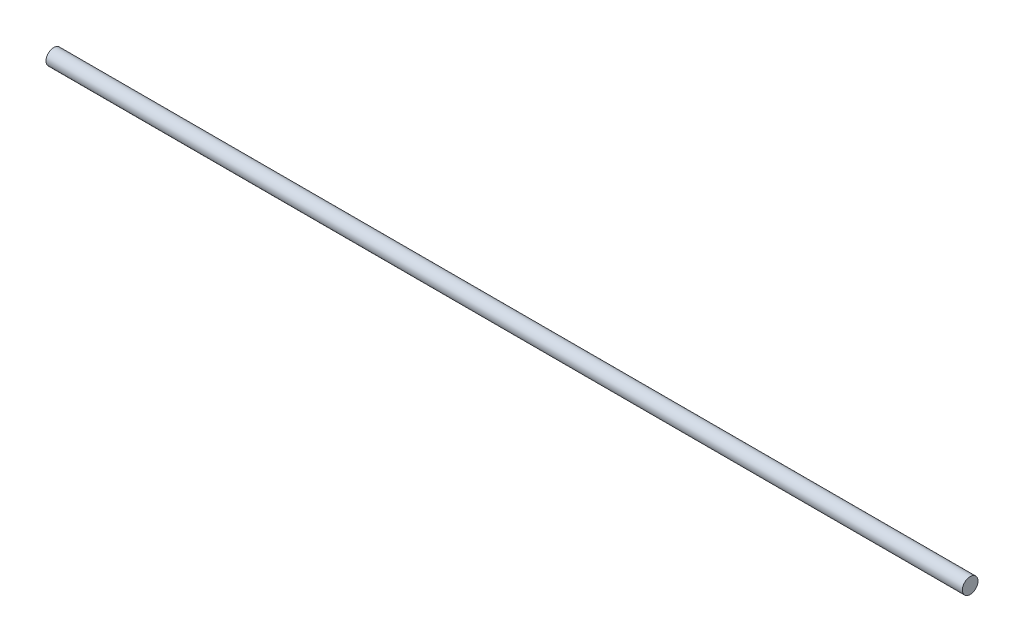
ISO-10303-21;
HEADER;
FILE_DESCRIPTION(('STEP AP214'),'2;1');
FILE_NAME('part.step','',(''),(''),'','','');
FILE_SCHEMA(('AUTOMOTIVE_DESIGN { 1 0 10303 214 1 1 1 1 }'));
ENDSEC;
DATA;
#1=APPLICATION_CONTEXT('core data for automotive mechanical design processes');
#2=APPLICATION_PROTOCOL_DEFINITION('international standard','automotive_design',2000,#1);
#3=PRODUCT_CONTEXT('',#1,'mechanical');
#4=PRODUCT('Part','Part','',(#3));
#5=PRODUCT_RELATED_PRODUCT_CATEGORY('part','',(#4));
#6=PRODUCT_DEFINITION_FORMATION('','',#4);
#7=PRODUCT_DEFINITION_CONTEXT('part definition',#1,'design');
#8=PRODUCT_DEFINITION('design','',#6,#7);
#9=PRODUCT_DEFINITION_SHAPE('','',#8);
#10=(LENGTH_UNIT() NAMED_UNIT(*) SI_UNIT(.MILLI.,.METRE.));
#11=(NAMED_UNIT(*) PLANE_ANGLE_UNIT() SI_UNIT($,.RADIAN.));
#12=(NAMED_UNIT(*) SI_UNIT($,.STERADIAN.) SOLID_ANGLE_UNIT());
#13=UNCERTAINTY_MEASURE_WITH_UNIT(LENGTH_MEASURE(1.E-05),#10,'distance_accuracy_value','');
#14=(GEOMETRIC_REPRESENTATION_CONTEXT(3) GLOBAL_UNCERTAINTY_ASSIGNED_CONTEXT((#13)) GLOBAL_UNIT_ASSIGNED_CONTEXT((#10,
#11,#12)) REPRESENTATION_CONTEXT('',''));
#15=CARTESIAN_POINT('',(0.,0.,0.));
#16=DIRECTION('',(0.,0.,1.));
#17=DIRECTION('',(1.,0.,0.));
#18=AXIS2_PLACEMENT_3D('',#15,#16,#17);
#19=CARTESIAN_POINT('',(4700.,0.,0.));
#20=DIRECTION('',(-1.,0.,0.));
#21=DIRECTION('',(0.,0.,1.));
#22=AXIS2_PLACEMENT_3D('',#19,#20,#21);
#23=CYLINDRICAL_SURFACE('',#22,40.);
#24=CARTESIAN_POINT('',(4700.,0.,0.));
#25=DIRECTION('',(1.,0.,0.));
#26=DIRECTION('',(0.,0.,-1.));
#27=AXIS2_PLACEMENT_3D('',#24,#25,#26);
#28=CIRCLE('',#27,40.);
#29=CARTESIAN_POINT('',(4700.,0.,-40.));
#30=VERTEX_POINT('',#29);
#31=EDGE_CURVE('E10',#30,#30,#28,.T.);
#32=ORIENTED_EDGE('',*,*,#31,.F.);
#33=EDGE_LOOP('',(#32));
#34=FACE_BOUND('',#33,.T.);
#35=CARTESIAN_POINT('',(0.,0.,0.));
#36=DIRECTION('',(1.,0.,0.));
#37=DIRECTION('',(0.,0.,-1.));
#38=AXIS2_PLACEMENT_3D('',#35,#36,#37);
#39=CIRCLE('',#38,40.);
#40=CARTESIAN_POINT('',(0.,0.,-40.));
#41=VERTEX_POINT('',#40);
#42=EDGE_CURVE('E37',#41,#41,#39,.T.);
#43=ORIENTED_EDGE('',*,*,#42,.T.);
#44=EDGE_LOOP('',(#43));
#45=FACE_BOUND('',#44,.T.);
#46=ADVANCED_FACE('F34',(#34,#45),#23,.T.);
#47=CARTESIAN_POINT('',(4700.,0.,0.));
#48=DIRECTION('',(1.,0.,0.));
#49=DIRECTION('',(0.,0.,-1.));
#50=AXIS2_PLACEMENT_3D('',#47,#48,#49);
#51=PLANE('',#50);
#52=ORIENTED_EDGE('',*,*,#31,.T.);
#53=EDGE_LOOP('',(#52));
#54=FACE_BOUND('',#53,.T.);
#55=ADVANCED_FACE('F49',(#54),#51,.T.);
#56=CARTESIAN_POINT('',(0.,0.,0.));
#57=DIRECTION('',(1.,0.,0.));
#58=DIRECTION('',(0.,0.,-1.));
#59=AXIS2_PLACEMENT_3D('',#56,#57,#58);
#60=PLANE('',#59);
#61=ORIENTED_EDGE('',*,*,#42,.F.);
#62=EDGE_LOOP('',(#61));
#63=FACE_BOUND('',#62,.T.);
#64=ADVANCED_FACE('F47',(#63),#60,.F.);
#65=CLOSED_SHELL('',(#46,#55,#64));
#66=MANIFOLD_SOLID_BREP('B2',#65);
#67=ADVANCED_BREP_SHAPE_REPRESENTATION('',(#18,#66),#14);
#68=SHAPE_DEFINITION_REPRESENTATION(#9,#67);
ENDSEC;
END-ISO-10303-21;
